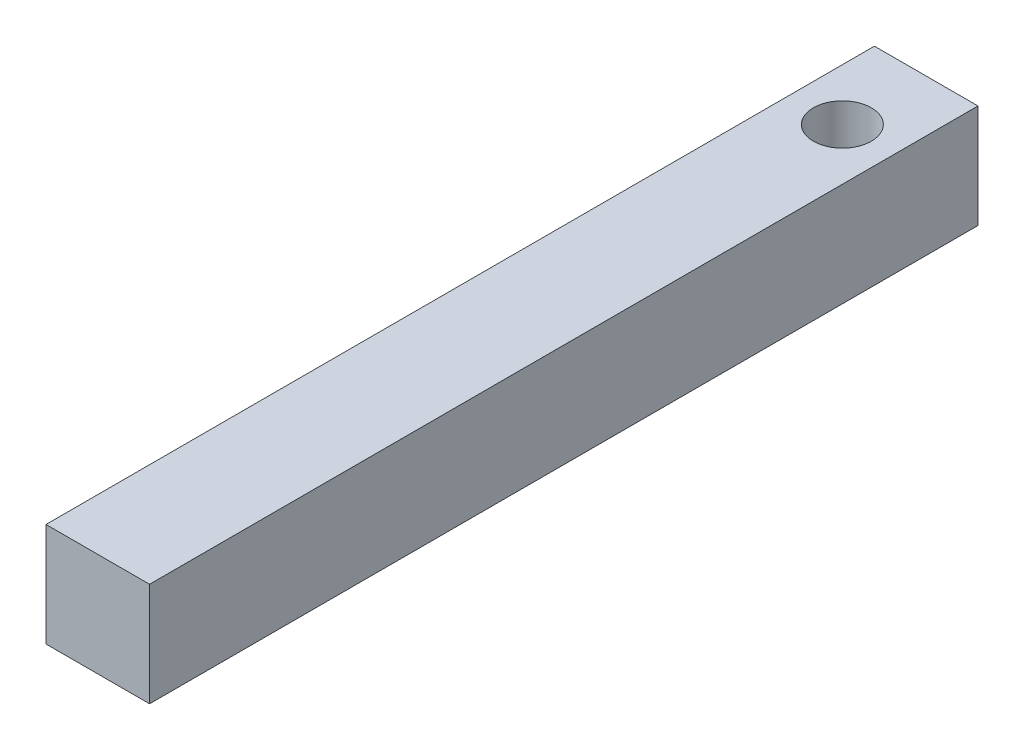
ISO-10303-21;
HEADER;
FILE_DESCRIPTION(('STEP AP214'),'2;1');
FILE_NAME('part.step','',(''),(''),'','','');
FILE_SCHEMA(('AUTOMOTIVE_DESIGN { 1 0 10303 214 1 1 1 1 }'));
ENDSEC;
DATA;
#1=APPLICATION_CONTEXT('core data for automotive mechanical design processes');
#2=APPLICATION_PROTOCOL_DEFINITION('international standard','automotive_design',2000,#1);
#3=PRODUCT_CONTEXT('',#1,'mechanical');
#4=PRODUCT('Part','Part','',(#3));
#5=PRODUCT_RELATED_PRODUCT_CATEGORY('part','',(#4));
#6=PRODUCT_DEFINITION_FORMATION('','',#4);
#7=PRODUCT_DEFINITION_CONTEXT('part definition',#1,'design');
#8=PRODUCT_DEFINITION('design','',#6,#7);
#9=PRODUCT_DEFINITION_SHAPE('','',#8);
#10=(LENGTH_UNIT() NAMED_UNIT(*) SI_UNIT(.MILLI.,.METRE.));
#11=(NAMED_UNIT(*) PLANE_ANGLE_UNIT() SI_UNIT($,.RADIAN.));
#12=(NAMED_UNIT(*) SI_UNIT($,.STERADIAN.) SOLID_ANGLE_UNIT());
#13=UNCERTAINTY_MEASURE_WITH_UNIT(LENGTH_MEASURE(1.E-05),#10,'distance_accuracy_value','');
#14=(GEOMETRIC_REPRESENTATION_CONTEXT(3) GLOBAL_UNCERTAINTY_ASSIGNED_CONTEXT((#13)) GLOBAL_UNIT_ASSIGNED_CONTEXT((#10,
#11,#12)) REPRESENTATION_CONTEXT('',''));
#15=CARTESIAN_POINT('',(0.,0.,0.));
#16=DIRECTION('',(0.,0.,1.));
#17=DIRECTION('',(1.,0.,0.));
#18=AXIS2_PLACEMENT_3D('',#15,#16,#17);
#19=CARTESIAN_POINT('',(0.,0.,203.2));
#20=DIRECTION('',(1.,0.,0.));
#21=DIRECTION('',(0.,0.,-1.));
#22=AXIS2_PLACEMENT_3D('',#19,#20,#21);
#23=PLANE('',#22);
#24=DIRECTION('',(0.,-1.,0.));
#25=VECTOR('',#24,1.);
#26=CARTESIAN_POINT('',(0.,0.,0.));
#27=LINE('',#26,#25);
#28=CARTESIAN_POINT('',(0.,25.4,0.));
#29=VERTEX_POINT('',#28);
#30=CARTESIAN_POINT('',(0.,0.,0.));
#31=VERTEX_POINT('',#30);
#32=EDGE_CURVE('E96',#29,#31,#27,.T.);
#33=ORIENTED_EDGE('',*,*,#32,.T.);
#34=DIRECTION('',(0.,0.,-1.));
#35=VECTOR('',#34,1.);
#36=CARTESIAN_POINT('',(0.,0.,203.2));
#37=LINE('',#36,#35);
#38=CARTESIAN_POINT('',(0.,0.,203.2));
#39=VERTEX_POINT('',#38);
#40=EDGE_CURVE('E11',#39,#31,#37,.T.);
#41=ORIENTED_EDGE('',*,*,#40,.F.);
#42=DIRECTION('',(0.,-1.,0.));
#43=VECTOR('',#42,1.);
#44=CARTESIAN_POINT('',(0.,0.,203.2));
#45=LINE('',#44,#43);
#46=CARTESIAN_POINT('',(0.,25.4,203.2));
#47=VERTEX_POINT('',#46);
#48=EDGE_CURVE('E84',#47,#39,#45,.T.);
#49=ORIENTED_EDGE('',*,*,#48,.F.);
#50=DIRECTION('',(0.,0.,-1.));
#51=VECTOR('',#50,1.);
#52=CARTESIAN_POINT('',(0.,25.4,203.2));
#53=LINE('',#52,#51);
#54=EDGE_CURVE('E92',#47,#29,#53,.T.);
#55=ORIENTED_EDGE('',*,*,#54,.T.);
#56=EDGE_LOOP('',(#33,#41,#49,#55));
#57=FACE_BOUND('',#56,.T.);
#58=ADVANCED_FACE('F33',(#57),#23,.F.);
#59=CARTESIAN_POINT('',(0.,0.,203.2));
#60=DIRECTION('',(0.,1.,0.));
#61=DIRECTION('',(0.,0.,1.));
#62=AXIS2_PLACEMENT_3D('',#59,#60,#61);
#63=PLANE('',#62);
#64=CARTESIAN_POINT('',(12.7,0.,20.574));
#65=DIRECTION('',(0.,1.,0.));
#66=DIRECTION('',(0.,0.,1.));
#67=AXIS2_PLACEMENT_3D('',#64,#65,#66);
#68=CIRCLE('',#67,7.112);
#69=CARTESIAN_POINT('',(12.7,0.,27.686));
#70=VERTEX_POINT('',#69);
#71=EDGE_CURVE('E99',#70,#70,#68,.T.);
#72=ORIENTED_EDGE('',*,*,#71,.T.);
#73=EDGE_LOOP('',(#72));
#74=FACE_BOUND('',#73,.T.);
#75=DIRECTION('',(1.,0.,0.));
#76=VECTOR('',#75,1.);
#77=CARTESIAN_POINT('',(0.,0.,0.));
#78=LINE('',#77,#76);
#79=CARTESIAN_POINT('',(25.4,0.,0.));
#80=VERTEX_POINT('',#79);
#81=EDGE_CURVE('E88',#31,#80,#78,.T.);
#82=ORIENTED_EDGE('',*,*,#81,.T.);
#83=DIRECTION('',(0.,0.,-1.));
#84=VECTOR('',#83,1.);
#85=CARTESIAN_POINT('',(25.4,0.,203.2));
#86=LINE('',#85,#84);
#87=CARTESIAN_POINT('',(25.4,0.,203.2));
#88=VERTEX_POINT('',#87);
#89=EDGE_CURVE('E41',#88,#80,#86,.T.);
#90=ORIENTED_EDGE('',*,*,#89,.F.);
#91=DIRECTION('',(1.,0.,0.));
#92=VECTOR('',#91,1.);
#93=CARTESIAN_POINT('',(0.,0.,203.2));
#94=LINE('',#93,#92);
#95=EDGE_CURVE('E79',#39,#88,#94,.T.);
#96=ORIENTED_EDGE('',*,*,#95,.F.);
#97=ORIENTED_EDGE('',*,*,#40,.T.);
#98=EDGE_LOOP('',(#82,#90,#96,#97));
#99=FACE_BOUND('',#98,.T.);
#100=ADVANCED_FACE('F87',(#74,#99),#63,.F.);
#101=CARTESIAN_POINT('',(25.4,0.,203.2));
#102=DIRECTION('',(-1.,0.,0.));
#103=DIRECTION('',(0.,0.,1.));
#104=AXIS2_PLACEMENT_3D('',#101,#102,#103);
#105=PLANE('',#104);
#106=DIRECTION('',(0.,1.,0.));
#107=VECTOR('',#106,1.);
#108=CARTESIAN_POINT('',(25.4,0.,0.));
#109=LINE('',#108,#107);
#110=CARTESIAN_POINT('',(25.4,25.4,0.));
#111=VERTEX_POINT('',#110);
#112=EDGE_CURVE('E66',#80,#111,#109,.T.);
#113=ORIENTED_EDGE('',*,*,#112,.T.);
#114=DIRECTION('',(0.,0.,-1.));
#115=VECTOR('',#114,1.);
#116=CARTESIAN_POINT('',(25.4,25.4,203.2));
#117=LINE('',#116,#115);
#118=CARTESIAN_POINT('',(25.4,25.4,203.2));
#119=VERTEX_POINT('',#118);
#120=EDGE_CURVE('E89',#119,#111,#117,.T.);
#121=ORIENTED_EDGE('',*,*,#120,.F.);
#122=DIRECTION('',(0.,1.,0.));
#123=VECTOR('',#122,1.);
#124=CARTESIAN_POINT('',(25.4,0.,203.2));
#125=LINE('',#124,#123);
#126=EDGE_CURVE('E82',#88,#119,#125,.T.);
#127=ORIENTED_EDGE('',*,*,#126,.F.);
#128=ORIENTED_EDGE('',*,*,#89,.T.);
#129=EDGE_LOOP('',(#113,#121,#127,#128));
#130=FACE_BOUND('',#129,.T.);
#131=ADVANCED_FACE('F90',(#130),#105,.F.);
#132=CARTESIAN_POINT('',(0.,25.4,203.2));
#133=DIRECTION('',(0.,-1.,0.));
#134=DIRECTION('',(0.,0.,-1.));
#135=AXIS2_PLACEMENT_3D('',#132,#133,#134);
#136=PLANE('',#135);
#137=CARTESIAN_POINT('',(12.7,25.4,20.574));
#138=DIRECTION('',(0.,1.,0.));
#139=DIRECTION('',(0.,0.,1.));
#140=AXIS2_PLACEMENT_3D('',#137,#138,#139);
#141=CIRCLE('',#140,7.112);
#142=CARTESIAN_POINT('',(12.7,25.4,27.686));
#143=VERTEX_POINT('',#142);
#144=EDGE_CURVE('E110',#143,#143,#141,.T.);
#145=ORIENTED_EDGE('',*,*,#144,.F.);
#146=EDGE_LOOP('',(#145));
#147=FACE_BOUND('',#146,.T.);
#148=DIRECTION('',(-1.,0.,0.));
#149=VECTOR('',#148,1.);
#150=CARTESIAN_POINT('',(0.,25.4,0.));
#151=LINE('',#150,#149);
#152=EDGE_CURVE('E72',#111,#29,#151,.T.);
#153=ORIENTED_EDGE('',*,*,#152,.T.);
#154=ORIENTED_EDGE('',*,*,#54,.F.);
#155=DIRECTION('',(-1.,0.,0.));
#156=VECTOR('',#155,1.);
#157=CARTESIAN_POINT('',(0.,25.4,203.2));
#158=LINE('',#157,#156);
#159=EDGE_CURVE('E49',#119,#47,#158,.T.);
#160=ORIENTED_EDGE('',*,*,#159,.F.);
#161=ORIENTED_EDGE('',*,*,#120,.T.);
#162=EDGE_LOOP('',(#153,#154,#160,#161));
#163=FACE_BOUND('',#162,.T.);
#164=ADVANCED_FACE('F104',(#147,#163),#136,.F.);
#165=CARTESIAN_POINT('',(0.,0.,203.2));
#166=DIRECTION('',(0.,0.,-1.));
#167=DIRECTION('',(-1.,0.,0.));
#168=AXIS2_PLACEMENT_3D('',#165,#166,#167);
#169=PLANE('',#168);
#170=ORIENTED_EDGE('',*,*,#48,.T.);
#171=ORIENTED_EDGE('',*,*,#95,.T.);
#172=ORIENTED_EDGE('',*,*,#126,.T.);
#173=ORIENTED_EDGE('',*,*,#159,.T.);
#174=EDGE_LOOP('',(#170,#171,#172,#173));
#175=FACE_BOUND('',#174,.T.);
#176=ADVANCED_FACE('F80',(#175),#169,.F.);
#177=CARTESIAN_POINT('',(0.,0.,0.));
#178=DIRECTION('',(0.,0.,-1.));
#179=DIRECTION('',(-1.,0.,0.));
#180=AXIS2_PLACEMENT_3D('',#177,#178,#179);
#181=PLANE('',#180);
#182=ORIENTED_EDGE('',*,*,#32,.F.);
#183=ORIENTED_EDGE('',*,*,#152,.F.);
#184=ORIENTED_EDGE('',*,*,#112,.F.);
#185=ORIENTED_EDGE('',*,*,#81,.F.);
#186=EDGE_LOOP('',(#182,#183,#184,#185));
#187=FACE_BOUND('',#186,.T.);
#188=ADVANCED_FACE('F107',(#187),#181,.T.);
#189=CARTESIAN_POINT('',(12.7,0.,20.574));
#190=DIRECTION('',(0.,1.,0.));
#191=DIRECTION('',(0.,0.,1.));
#192=AXIS2_PLACEMENT_3D('',#189,#190,#191);
#193=CYLINDRICAL_SURFACE('',#192,7.112);
#194=ORIENTED_EDGE('',*,*,#71,.F.);
#195=EDGE_LOOP('',(#194));
#196=FACE_BOUND('',#195,.T.);
#197=ORIENTED_EDGE('',*,*,#144,.T.);
#198=EDGE_LOOP('',(#197));
#199=FACE_BOUND('',#198,.T.);
#200=ADVANCED_FACE('F117',(#196,#199),#193,.F.);
#201=CLOSED_SHELL('',(#58,#100,#131,#164,#176,#188,#200));
#202=MANIFOLD_SOLID_BREP('B2',#201);
#203=ADVANCED_BREP_SHAPE_REPRESENTATION('',(#18,#202),#14);
#204=SHAPE_DEFINITION_REPRESENTATION(#9,#203);
ENDSEC;
END-ISO-10303-21;
